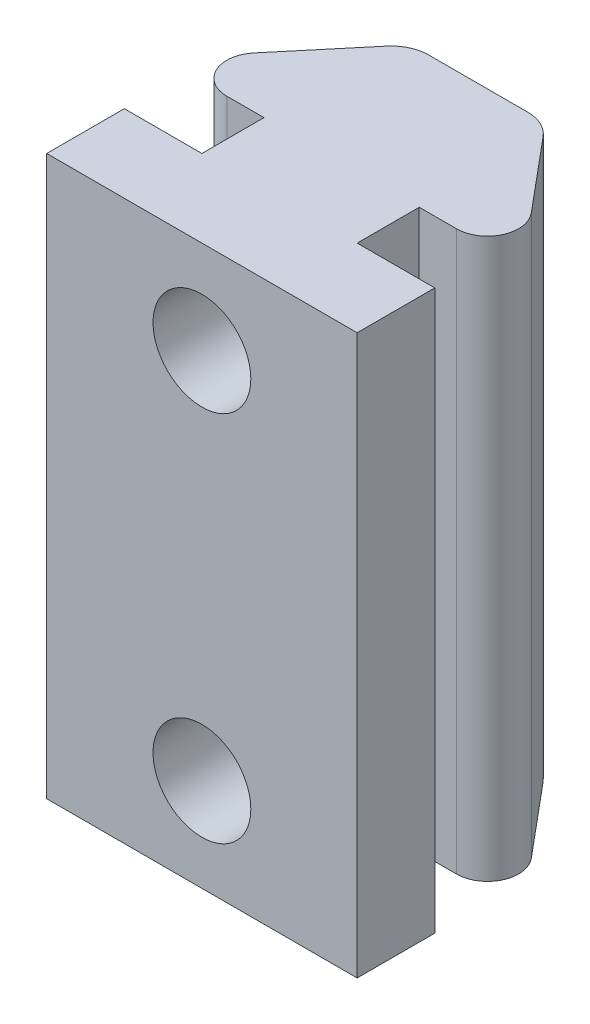
ISO-10303-21;
HEADER;
FILE_DESCRIPTION(('STEP AP214'),'2;1');
FILE_NAME('part.step','',(''),(''),'','','');
FILE_SCHEMA(('AUTOMOTIVE_DESIGN { 1 0 10303 214 1 1 1 1 }'));
ENDSEC;
DATA;
#1=APPLICATION_CONTEXT('core data for automotive mechanical design processes');
#2=APPLICATION_PROTOCOL_DEFINITION('international standard','automotive_design',2000,#1);
#3=PRODUCT_CONTEXT('',#1,'mechanical');
#4=PRODUCT('Part','Part','',(#3));
#5=PRODUCT_RELATED_PRODUCT_CATEGORY('part','',(#4));
#6=PRODUCT_DEFINITION_FORMATION('','',#4);
#7=PRODUCT_DEFINITION_CONTEXT('part definition',#1,'design');
#8=PRODUCT_DEFINITION('design','',#6,#7);
#9=PRODUCT_DEFINITION_SHAPE('','',#8);
#10=(LENGTH_UNIT() NAMED_UNIT(*) SI_UNIT(.MILLI.,.METRE.));
#11=(NAMED_UNIT(*) PLANE_ANGLE_UNIT() SI_UNIT($,.RADIAN.));
#12=(NAMED_UNIT(*) SI_UNIT($,.STERADIAN.) SOLID_ANGLE_UNIT());
#13=UNCERTAINTY_MEASURE_WITH_UNIT(LENGTH_MEASURE(1.E-05),#10,'distance_accuracy_value','');
#14=(GEOMETRIC_REPRESENTATION_CONTEXT(3) GLOBAL_UNCERTAINTY_ASSIGNED_CONTEXT((#13)) GLOBAL_UNIT_ASSIGNED_CONTEXT((#10,
#11,#12)) REPRESENTATION_CONTEXT('',''));
#15=CARTESIAN_POINT('',(0.,0.,0.));
#16=DIRECTION('',(0.,0.,1.));
#17=DIRECTION('',(1.,0.,0.));
#18=AXIS2_PLACEMENT_3D('',#15,#16,#17);
#19=CARTESIAN_POINT('',(0.,0.,0.));
#20=DIRECTION('',(0.,0.,1.));
#21=DIRECTION('',(1.,0.,0.));
#22=AXIS2_PLACEMENT_3D('',#19,#20,#21);
#23=PLANE('',#22);
#24=DIRECTION('',(0.,1.,0.));
#25=VECTOR('',#24,1.);
#26=CARTESIAN_POINT('',(-3.175,-25.8729235263508,0.));
#27=LINE('',#26,#25);
#28=CARTESIAN_POINT('',(-3.175,-11.43,0.));
#29=VERTEX_POINT('',#28);
#30=CARTESIAN_POINT('',(-3.175,11.43,0.));
#31=VERTEX_POINT('',#30);
#32=EDGE_CURVE('E64',#29,#31,#27,.T.);
#33=ORIENTED_EDGE('',*,*,#32,.F.);
#34=DIRECTION('',(1.,0.,0.));
#35=VECTOR('',#34,1.);
#36=CARTESIAN_POINT('',(-6.35,-11.43,0.));
#37=LINE('',#36,#35);
#38=CARTESIAN_POINT('',(-6.35,-11.43,0.));
#39=VERTEX_POINT('',#38);
#40=EDGE_CURVE('E251',#39,#29,#37,.T.);
#41=ORIENTED_EDGE('',*,*,#40,.F.);
#42=DIRECTION('',(0.,1.,0.));
#43=VECTOR('',#42,1.);
#44=CARTESIAN_POINT('',(-6.35,-11.43,0.));
#45=LINE('',#44,#43);
#46=CARTESIAN_POINT('',(-6.35,11.43,0.));
#47=VERTEX_POINT('',#46);
#48=EDGE_CURVE('E239',#39,#47,#45,.T.);
#49=ORIENTED_EDGE('',*,*,#48,.T.);
#50=DIRECTION('',(1.,0.,0.));
#51=VECTOR('',#50,1.);
#52=CARTESIAN_POINT('',(-6.35,11.43,0.));
#53=LINE('',#52,#51);
#54=EDGE_CURVE('E246',#47,#31,#53,.T.);
#55=ORIENTED_EDGE('',*,*,#54,.T.);
#56=EDGE_LOOP('',(#33,#41,#49,#55));
#57=FACE_BOUND('',#56,.T.);
#58=ADVANCED_FACE('F39',(#57),#23,.F.);
#59=CARTESIAN_POINT('',(-6.35,11.43,3.175));
#60=DIRECTION('',(0.,1.,0.));
#61=DIRECTION('',(0.,0.,1.));
#62=AXIS2_PLACEMENT_3D('',#59,#60,#61);
#63=PLANE('',#62);
#64=ORIENTED_EDGE('',*,*,#54,.F.);
#65=DIRECTION('',(0.,0.,-1.));
#66=VECTOR('',#65,1.);
#67=CARTESIAN_POINT('',(-6.35,11.43,3.175));
#68=LINE('',#67,#66);
#69=CARTESIAN_POINT('',(-6.35,11.43,3.175));
#70=VERTEX_POINT('',#69);
#71=EDGE_CURVE('E11',#70,#47,#68,.T.);
#72=ORIENTED_EDGE('',*,*,#71,.F.);
#73=DIRECTION('',(1.,0.,0.));
#74=VECTOR('',#73,1.);
#75=CARTESIAN_POINT('',(-6.35,11.43,3.175));
#76=LINE('',#75,#74);
#77=CARTESIAN_POINT('',(6.35,11.43,3.175));
#78=VERTEX_POINT('',#77);
#79=EDGE_CURVE('E235',#70,#78,#76,.T.);
#80=ORIENTED_EDGE('',*,*,#79,.T.);
#81=DIRECTION('',(0.,0.,-1.));
#82=VECTOR('',#81,1.);
#83=CARTESIAN_POINT('',(6.35,11.43,3.175));
#84=LINE('',#83,#82);
#85=CARTESIAN_POINT('',(6.35,11.43,0.));
#86=VERTEX_POINT('',#85);
#87=EDGE_CURVE('E43',#78,#86,#84,.T.);
#88=ORIENTED_EDGE('',*,*,#87,.T.);
#89=CARTESIAN_POINT('',(3.175,11.43,0.));
#90=VERTEX_POINT('',#89);
#91=EDGE_CURVE('E179',#90,#86,#53,.T.);
#92=ORIENTED_EDGE('',*,*,#91,.F.);
#93=DIRECTION('',(0.,0.,-1.));
#94=VECTOR('',#93,1.);
#95=CARTESIAN_POINT('',(3.175,11.43,0.));
#96=LINE('',#95,#94);
#97=CARTESIAN_POINT('',(3.175,11.43,-2.54));
#98=VERTEX_POINT('',#97);
#99=EDGE_CURVE('E160',#90,#98,#96,.T.);
#100=ORIENTED_EDGE('',*,*,#99,.T.);
#101=DIRECTION('',(1.,0.,0.));
#102=VECTOR('',#101,1.);
#103=CARTESIAN_POINT('',(3.175,11.43,-2.54));
#104=LINE('',#103,#102);
#105=CARTESIAN_POINT('',(4.69937299864937,11.43,-2.54));
#106=VERTEX_POINT('',#105);
#107=EDGE_CURVE('E168',#98,#106,#104,.T.);
#108=ORIENTED_EDGE('',*,*,#107,.T.);
#109=CARTESIAN_POINT('',(4.69937299864937,11.43,-3.81));
#110=DIRECTION('',(0.,1.,0.));
#111=DIRECTION('',(0.,0.,1.));
#112=AXIS2_PLACEMENT_3D('',#109,#110,#111);
#113=CIRCLE('',#112,1.27);
#114=CARTESIAN_POINT('',(5.67365047720945,11.43,-4.6246676590921));
#115=VERTEX_POINT('',#114);
#116=EDGE_CURVE('E174',#106,#115,#113,.T.);
#117=ORIENTED_EDGE('',*,*,#116,.T.);
#118=DIRECTION('',(-0.64147059771032,0.,-0.767147620913449));
#119=VECTOR('',#118,1.);
#120=CARTESIAN_POINT('',(5.67365047720945,11.43,-4.62466765909211));
#121=LINE('',#120,#119);
#122=CARTESIAN_POINT('',(3.20113297427209,11.43,-7.58160119091053));
#123=VERTEX_POINT('',#122);
#124=EDGE_CURVE('E190',#115,#123,#121,.T.);
#125=ORIENTED_EDGE('',*,*,#124,.T.);
#126=CARTESIAN_POINT('',(2.032,11.43,-6.604));
#127=DIRECTION('',(0.,1.,0.));
#128=DIRECTION('',(0.,0.,1.));
#129=AXIS2_PLACEMENT_3D('',#126,#127,#128);
#130=CIRCLE('',#129,1.524);
#131=CARTESIAN_POINT('',(2.032,11.43,-8.128));
#132=VERTEX_POINT('',#131);
#133=EDGE_CURVE('E193',#123,#132,#130,.T.);
#134=ORIENTED_EDGE('',*,*,#133,.T.);
#135=DIRECTION('',(-1.,0.,0.));
#136=VECTOR('',#135,1.);
#137=CARTESIAN_POINT('',(2.032,11.43,-8.128));
#138=LINE('',#137,#136);
#139=CARTESIAN_POINT('',(-2.032,11.43,-8.128));
#140=VERTEX_POINT('',#139);
#141=EDGE_CURVE('E196',#132,#140,#138,.T.);
#142=ORIENTED_EDGE('',*,*,#141,.T.);
#143=CARTESIAN_POINT('',(-2.032,11.43,-6.604));
#144=DIRECTION('',(0.,1.,0.));
#145=DIRECTION('',(0.,0.,-1.));
#146=AXIS2_PLACEMENT_3D('',#143,#144,#145);
#147=CIRCLE('',#146,1.524);
#148=CARTESIAN_POINT('',(-3.2011329742721,11.43,-7.58160119091053));
#149=VERTEX_POINT('',#148);
#150=EDGE_CURVE('E199',#140,#149,#147,.T.);
#151=ORIENTED_EDGE('',*,*,#150,.T.);
#152=DIRECTION('',(-0.64147059771032,0.,0.767147620913449));
#153=VECTOR('',#152,1.);
#154=CARTESIAN_POINT('',(-5.67365047720945,11.43,-4.62466765909211));
#155=LINE('',#154,#153);
#156=CARTESIAN_POINT('',(-5.67365047720945,11.43,-4.62466765909211));
#157=VERTEX_POINT('',#156);
#158=EDGE_CURVE('E202',#149,#157,#155,.T.);
#159=ORIENTED_EDGE('',*,*,#158,.T.);
#160=CARTESIAN_POINT('',(-4.69937299864937,11.43,-3.81));
#161=DIRECTION('',(0.,1.,0.));
#162=DIRECTION('',(0.,0.,-1.));
#163=AXIS2_PLACEMENT_3D('',#160,#161,#162);
#164=CIRCLE('',#163,1.27);
#165=CARTESIAN_POINT('',(-4.69937299864937,11.43,-2.54));
#166=VERTEX_POINT('',#165);
#167=EDGE_CURVE('E205',#157,#166,#164,.T.);
#168=ORIENTED_EDGE('',*,*,#167,.T.);
#169=DIRECTION('',(1.,0.,0.));
#170=VECTOR('',#169,1.);
#171=CARTESIAN_POINT('',(-3.175,11.43,-2.54));
#172=LINE('',#171,#170);
#173=CARTESIAN_POINT('',(-3.175,11.43,-2.54));
#174=VERTEX_POINT('',#173);
#175=EDGE_CURVE('E208',#166,#174,#172,.T.);
#176=ORIENTED_EDGE('',*,*,#175,.T.);
#177=DIRECTION('',(0.,0.,1.));
#178=VECTOR('',#177,1.);
#179=CARTESIAN_POINT('',(-3.175,11.43,0.));
#180=LINE('',#179,#178);
#181=EDGE_CURVE('E211',#174,#31,#180,.T.);
#182=ORIENTED_EDGE('',*,*,#181,.T.);
#183=EDGE_LOOP('',(#64,#72,#80,#88,#92,#100,#108,#117,#125,#134,#142,#151,#159,#168,#176,#182));
#184=FACE_BOUND('',#183,.T.);
#185=ADVANCED_FACE('F41',(#184),#63,.T.);
#186=CARTESIAN_POINT('',(-6.35,-11.43,3.175));
#187=DIRECTION('',(-1.,0.,0.));
#188=DIRECTION('',(0.,0.,1.));
#189=AXIS2_PLACEMENT_3D('',#186,#187,#188);
#190=PLANE('',#189);
#191=ORIENTED_EDGE('',*,*,#48,.F.);
#192=DIRECTION('',(0.,0.,-1.));
#193=VECTOR('',#192,1.);
#194=CARTESIAN_POINT('',(-6.35,-11.43,3.175));
#195=LINE('',#194,#193);
#196=CARTESIAN_POINT('',(-6.35,-11.43,3.175));
#197=VERTEX_POINT('',#196);
#198=EDGE_CURVE('E48',#197,#39,#195,.T.);
#199=ORIENTED_EDGE('',*,*,#198,.F.);
#200=DIRECTION('',(0.,1.,0.));
#201=VECTOR('',#200,1.);
#202=CARTESIAN_POINT('',(-6.35,-11.43,3.175));
#203=LINE('',#202,#201);
#204=EDGE_CURVE('E243',#197,#70,#203,.T.);
#205=ORIENTED_EDGE('',*,*,#204,.T.);
#206=ORIENTED_EDGE('',*,*,#71,.T.);
#207=EDGE_LOOP('',(#191,#199,#205,#206));
#208=FACE_BOUND('',#207,.T.);
#209=ADVANCED_FACE('F284',(#208),#190,.T.);
#210=CARTESIAN_POINT('',(-6.35,-11.43,3.175));
#211=DIRECTION('',(0.,1.,0.));
#212=DIRECTION('',(0.,0.,1.));
#213=AXIS2_PLACEMENT_3D('',#210,#211,#212);
#214=PLANE('',#213);
#215=ORIENTED_EDGE('',*,*,#40,.T.);
#216=DIRECTION('',(0.,0.,-1.));
#217=VECTOR('',#216,1.);
#218=CARTESIAN_POINT('',(-3.175,-11.43,0.));
#219=LINE('',#218,#217);
#220=CARTESIAN_POINT('',(-3.175,-11.43,-2.54));
#221=VERTEX_POINT('',#220);
#222=EDGE_CURVE('E186',#29,#221,#219,.T.);
#223=ORIENTED_EDGE('',*,*,#222,.T.);
#224=DIRECTION('',(-1.,0.,0.));
#225=VECTOR('',#224,1.);
#226=CARTESIAN_POINT('',(-3.175,-11.43,-2.54));
#227=LINE('',#226,#225);
#228=CARTESIAN_POINT('',(-4.69937299864937,-11.43,-2.54));
#229=VERTEX_POINT('',#228);
#230=EDGE_CURVE('E476',#221,#229,#227,.T.);
#231=ORIENTED_EDGE('',*,*,#230,.T.);
#232=CARTESIAN_POINT('',(-4.69937299864937,-11.43,-3.81));
#233=DIRECTION('',(0.,1.,0.));
#234=DIRECTION('',(0.,0.,1.));
#235=AXIS2_PLACEMENT_3D('',#232,#233,#234);
#236=CIRCLE('',#235,1.27);
#237=CARTESIAN_POINT('',(-5.67365047720945,-11.43,-4.62466765909211));
#238=VERTEX_POINT('',#237);
#239=EDGE_CURVE('E475',#229,#238,#236,.F.);
#240=ORIENTED_EDGE('',*,*,#239,.T.);
#241=DIRECTION('',(0.641470597710321,0.,-0.767147620913449));
#242=VECTOR('',#241,1.);
#243=CARTESIAN_POINT('',(-5.67365047720945,-11.43,-4.62466765909211));
#244=LINE('',#243,#242);
#245=CARTESIAN_POINT('',(-3.2011329742721,-11.43,-7.58160119091053));
#246=VERTEX_POINT('',#245);
#247=EDGE_CURVE('E473',#238,#246,#244,.T.);
#248=ORIENTED_EDGE('',*,*,#247,.T.);
#249=CARTESIAN_POINT('',(-2.032,-11.43,-6.604));
#250=DIRECTION('',(0.,1.,0.));
#251=DIRECTION('',(0.,0.,1.));
#252=AXIS2_PLACEMENT_3D('',#249,#250,#251);
#253=CIRCLE('',#252,1.524);
#254=CARTESIAN_POINT('',(-2.032,-11.43,-8.128));
#255=VERTEX_POINT('',#254);
#256=EDGE_CURVE('E471',#246,#255,#253,.F.);
#257=ORIENTED_EDGE('',*,*,#256,.T.);
#258=DIRECTION('',(1.,0.,0.));
#259=VECTOR('',#258,1.);
#260=CARTESIAN_POINT('',(2.032,-11.43,-8.128));
#261=LINE('',#260,#259);
#262=CARTESIAN_POINT('',(2.032,-11.43,-8.128));
#263=VERTEX_POINT('',#262);
#264=EDGE_CURVE('E469',#255,#263,#261,.T.);
#265=ORIENTED_EDGE('',*,*,#264,.T.);
#266=CARTESIAN_POINT('',(2.032,-11.43,-6.604));
#267=DIRECTION('',(0.,1.,0.));
#268=DIRECTION('',(0.,0.,1.));
#269=AXIS2_PLACEMENT_3D('',#266,#267,#268);
#270=CIRCLE('',#269,1.524);
#271=CARTESIAN_POINT('',(3.2011329742721,-11.43,-7.58160119091053));
#272=VERTEX_POINT('',#271);
#273=EDGE_CURVE('E467',#263,#272,#270,.F.);
#274=ORIENTED_EDGE('',*,*,#273,.T.);
#275=DIRECTION('',(0.641470597710321,0.,0.767147620913449));
#276=VECTOR('',#275,1.);
#277=CARTESIAN_POINT('',(5.67365047720945,-11.43,-4.62466765909211));
#278=LINE('',#277,#276);
#279=CARTESIAN_POINT('',(5.67365047720945,-11.43,-4.6246676590921));
#280=VERTEX_POINT('',#279);
#281=EDGE_CURVE('E465',#272,#280,#278,.T.);
#282=ORIENTED_EDGE('',*,*,#281,.T.);
#283=CARTESIAN_POINT('',(4.69937299864937,-11.43,-3.81));
#284=DIRECTION('',(0.,1.,0.));
#285=DIRECTION('',(0.,0.,1.));
#286=AXIS2_PLACEMENT_3D('',#283,#284,#285);
#287=CIRCLE('',#286,1.27);
#288=CARTESIAN_POINT('',(4.69937299864937,-11.43,-2.54));
#289=VERTEX_POINT('',#288);
#290=EDGE_CURVE('E463',#280,#289,#287,.F.);
#291=ORIENTED_EDGE('',*,*,#290,.T.);
#292=DIRECTION('',(-1.,0.,0.));
#293=VECTOR('',#292,1.);
#294=CARTESIAN_POINT('',(3.175,-11.43,-2.54));
#295=LINE('',#294,#293);
#296=CARTESIAN_POINT('',(3.175,-11.43,-2.54));
#297=VERTEX_POINT('',#296);
#298=EDGE_CURVE('E215',#289,#297,#295,.T.);
#299=ORIENTED_EDGE('',*,*,#298,.T.);
#300=DIRECTION('',(0.,0.,1.));
#301=VECTOR('',#300,1.);
#302=CARTESIAN_POINT('',(3.175,-11.43,0.));
#303=LINE('',#302,#301);
#304=CARTESIAN_POINT('',(3.175,-11.43,0.));
#305=VERTEX_POINT('',#304);
#306=EDGE_CURVE('E161',#297,#305,#303,.T.);
#307=ORIENTED_EDGE('',*,*,#306,.T.);
#308=CARTESIAN_POINT('',(6.35,-11.43,0.));
#309=VERTEX_POINT('',#308);
#310=EDGE_CURVE('E56',#305,#309,#37,.T.);
#311=ORIENTED_EDGE('',*,*,#310,.T.);
#312=DIRECTION('',(0.,0.,-1.));
#313=VECTOR('',#312,1.);
#314=CARTESIAN_POINT('',(6.35,-11.43,3.175));
#315=LINE('',#314,#313);
#316=CARTESIAN_POINT('',(6.35,-11.43,3.175));
#317=VERTEX_POINT('',#316);
#318=EDGE_CURVE('E255',#317,#309,#315,.T.);
#319=ORIENTED_EDGE('',*,*,#318,.F.);
#320=DIRECTION('',(1.,0.,0.));
#321=VECTOR('',#320,1.);
#322=CARTESIAN_POINT('',(-6.35,-11.43,3.175));
#323=LINE('',#322,#321);
#324=EDGE_CURVE('E241',#197,#317,#323,.T.);
#325=ORIENTED_EDGE('',*,*,#324,.F.);
#326=ORIENTED_EDGE('',*,*,#198,.T.);
#327=EDGE_LOOP('',(#215,#223,#231,#240,#248,#257,#265,#274,#282,#291,#299,#307,#311,#319,#325,#326));
#328=FACE_BOUND('',#327,.T.);
#329=ADVANCED_FACE('F288',(#328),#214,.F.);
#330=CARTESIAN_POINT('',(6.35,-11.43,3.175));
#331=DIRECTION('',(-1.,0.,0.));
#332=DIRECTION('',(0.,0.,1.));
#333=AXIS2_PLACEMENT_3D('',#330,#331,#332);
#334=PLANE('',#333);
#335=DIRECTION('',(0.,1.,0.));
#336=VECTOR('',#335,1.);
#337=CARTESIAN_POINT('',(6.35,-11.43,0.));
#338=LINE('',#337,#336);
#339=EDGE_CURVE('E248',#309,#86,#338,.T.);
#340=ORIENTED_EDGE('',*,*,#339,.T.);
#341=ORIENTED_EDGE('',*,*,#87,.F.);
#342=DIRECTION('',(0.,1.,0.));
#343=VECTOR('',#342,1.);
#344=CARTESIAN_POINT('',(6.35,-11.43,3.175));
#345=LINE('',#344,#343);
#346=EDGE_CURVE('E238',#317,#78,#345,.T.);
#347=ORIENTED_EDGE('',*,*,#346,.F.);
#348=ORIENTED_EDGE('',*,*,#318,.T.);
#349=EDGE_LOOP('',(#340,#341,#347,#348));
#350=FACE_BOUND('',#349,.T.);
#351=ADVANCED_FACE('F262',(#350),#334,.F.);
#352=CARTESIAN_POINT('',(0.,0.,3.175));
#353=DIRECTION('',(0.,0.,1.));
#354=DIRECTION('',(1.,0.,0.));
#355=AXIS2_PLACEMENT_3D('',#352,#353,#354);
#356=PLANE('',#355);
#357=CARTESIAN_POINT('',(0.,7.62,3.175));
#358=DIRECTION('',(0.,0.,1.));
#359=DIRECTION('',(1.,0.,0.));
#360=AXIS2_PLACEMENT_3D('',#357,#358,#359);
#361=CIRCLE('',#360,2.);
#362=CARTESIAN_POINT('',(2.,7.62,3.175));
#363=VERTEX_POINT('',#362);
#364=EDGE_CURVE('E183',#363,#363,#361,.T.);
#365=ORIENTED_EDGE('',*,*,#364,.F.);
#366=EDGE_LOOP('',(#365));
#367=FACE_BOUND('',#366,.T.);
#368=CARTESIAN_POINT('',(0.,-7.62,3.175));
#369=DIRECTION('',(0.,0.,1.));
#370=DIRECTION('',(-1.,0.,0.));
#371=AXIS2_PLACEMENT_3D('',#368,#369,#370);
#372=CIRCLE('',#371,2.);
#373=CARTESIAN_POINT('',(2.,-7.62,3.175));
#374=VERTEX_POINT('',#373);
#375=EDGE_CURVE('E454',#374,#374,#372,.T.);
#376=ORIENTED_EDGE('',*,*,#375,.F.);
#377=EDGE_LOOP('',(#376));
#378=FACE_BOUND('',#377,.T.);
#379=ORIENTED_EDGE('',*,*,#79,.F.);
#380=ORIENTED_EDGE('',*,*,#204,.F.);
#381=ORIENTED_EDGE('',*,*,#324,.T.);
#382=ORIENTED_EDGE('',*,*,#346,.T.);
#383=EDGE_LOOP('',(#379,#380,#381,#382));
#384=FACE_BOUND('',#383,.T.);
#385=ADVANCED_FACE('F266',(#367,#378,#384),#356,.T.);
#386=ORIENTED_EDGE('',*,*,#310,.F.);
#387=DIRECTION('',(0.,1.,0.));
#388=VECTOR('',#387,1.);
#389=CARTESIAN_POINT('',(3.175,-25.8729235263508,0.));
#390=LINE('',#389,#388);
#391=EDGE_CURVE('E165',#305,#90,#390,.T.);
#392=ORIENTED_EDGE('',*,*,#391,.T.);
#393=ORIENTED_EDGE('',*,*,#91,.T.);
#394=ORIENTED_EDGE('',*,*,#339,.F.);
#395=EDGE_LOOP('',(#386,#392,#393,#394));
#396=FACE_BOUND('',#395,.T.);
#397=ADVANCED_FACE('F263',(#396),#23,.F.);
#398=CARTESIAN_POINT('',(-3.175,-25.8729235263508,0.));
#399=DIRECTION('',(-1.,0.,0.));
#400=DIRECTION('',(0.,0.,1.));
#401=AXIS2_PLACEMENT_3D('',#398,#399,#400);
#402=PLANE('',#401);
#403=ORIENTED_EDGE('',*,*,#222,.F.);
#404=ORIENTED_EDGE('',*,*,#32,.T.);
#405=ORIENTED_EDGE('',*,*,#181,.F.);
#406=DIRECTION('',(0.,1.,0.));
#407=VECTOR('',#406,1.);
#408=CARTESIAN_POINT('',(-3.175,-25.8729235263508,-2.54));
#409=LINE('',#408,#407);
#410=EDGE_CURVE('E216',#221,#174,#409,.T.);
#411=ORIENTED_EDGE('',*,*,#410,.F.);
#412=EDGE_LOOP('',(#403,#404,#405,#411));
#413=FACE_BOUND('',#412,.T.);
#414=ADVANCED_FACE('F265',(#413),#402,.T.);
#415=CARTESIAN_POINT('',(-3.175,-25.8729235263508,-2.54));
#416=DIRECTION('',(0.,0.,1.));
#417=DIRECTION('',(1.,0.,0.));
#418=AXIS2_PLACEMENT_3D('',#415,#416,#417);
#419=PLANE('',#418);
#420=ORIENTED_EDGE('',*,*,#230,.F.);
#421=ORIENTED_EDGE('',*,*,#410,.T.);
#422=ORIENTED_EDGE('',*,*,#175,.F.);
#423=DIRECTION('',(0.,1.,0.));
#424=VECTOR('',#423,1.);
#425=CARTESIAN_POINT('',(-4.69937299864937,-25.8729235263508,-2.54));
#426=LINE('',#425,#424);
#427=EDGE_CURVE('E218',#229,#166,#426,.T.);
#428=ORIENTED_EDGE('',*,*,#427,.F.);
#429=EDGE_LOOP('',(#420,#421,#422,#428));
#430=FACE_BOUND('',#429,.T.);
#431=ADVANCED_FACE('F272',(#430),#419,.T.);
#432=CARTESIAN_POINT('',(-4.69937299864937,-25.8729235263508,-3.81));
#433=DIRECTION('',(0.,1.,0.));
#434=DIRECTION('',(0.,0.,1.));
#435=AXIS2_PLACEMENT_3D('',#432,#433,#434);
#436=CYLINDRICAL_SURFACE('',#435,1.27);
#437=ORIENTED_EDGE('',*,*,#239,.F.);
#438=ORIENTED_EDGE('',*,*,#427,.T.);
#439=ORIENTED_EDGE('',*,*,#167,.F.);
#440=DIRECTION('',(0.,1.,0.));
#441=VECTOR('',#440,1.);
#442=CARTESIAN_POINT('',(-5.67365047720945,-25.8729235263508,-4.62466765909211));
#443=LINE('',#442,#441);
#444=EDGE_CURVE('E220',#238,#157,#443,.T.);
#445=ORIENTED_EDGE('',*,*,#444,.F.);
#446=EDGE_LOOP('',(#437,#438,#439,#445));
#447=FACE_BOUND('',#446,.T.);
#448=ADVANCED_FACE('F343',(#447),#436,.T.);
#449=CARTESIAN_POINT('',(-5.67365047720945,-25.8729235263508,-4.62466765909211));
#450=DIRECTION('',(-0.767147620913449,0.,-0.64147059771032));
#451=DIRECTION('',(-0.641470597710321,0.,0.767147620913449));
#452=AXIS2_PLACEMENT_3D('',#449,#450,#451);
#453=PLANE('',#452);
#454=ORIENTED_EDGE('',*,*,#247,.F.);
#455=ORIENTED_EDGE('',*,*,#444,.T.);
#456=ORIENTED_EDGE('',*,*,#158,.F.);
#457=DIRECTION('',(0.,1.,0.));
#458=VECTOR('',#457,1.);
#459=CARTESIAN_POINT('',(-3.2011329742721,-25.8729235263508,-7.58160119091053));
#460=LINE('',#459,#458);
#461=EDGE_CURVE('E222',#246,#149,#460,.T.);
#462=ORIENTED_EDGE('',*,*,#461,.F.);
#463=EDGE_LOOP('',(#454,#455,#456,#462));
#464=FACE_BOUND('',#463,.T.);
#465=ADVANCED_FACE('F353',(#464),#453,.T.);
#466=CARTESIAN_POINT('',(-2.032,-25.8729235263508,-6.604));
#467=DIRECTION('',(0.,1.,0.));
#468=DIRECTION('',(0.,0.,1.));
#469=AXIS2_PLACEMENT_3D('',#466,#467,#468);
#470=CYLINDRICAL_SURFACE('',#469,1.524);
#471=ORIENTED_EDGE('',*,*,#256,.F.);
#472=ORIENTED_EDGE('',*,*,#461,.T.);
#473=ORIENTED_EDGE('',*,*,#150,.F.);
#474=DIRECTION('',(0.,1.,0.));
#475=VECTOR('',#474,1.);
#476=CARTESIAN_POINT('',(-2.032,-25.8729235263508,-8.128));
#477=LINE('',#476,#475);
#478=EDGE_CURVE('E224',#255,#140,#477,.T.);
#479=ORIENTED_EDGE('',*,*,#478,.F.);
#480=EDGE_LOOP('',(#471,#472,#473,#479));
#481=FACE_BOUND('',#480,.T.);
#482=ADVANCED_FACE('F363',(#481),#470,.T.);
#483=CARTESIAN_POINT('',(2.032,-25.8729235263508,-8.128));
#484=DIRECTION('',(0.,0.,-1.));
#485=DIRECTION('',(-1.,0.,0.));
#486=AXIS2_PLACEMENT_3D('',#483,#484,#485);
#487=PLANE('',#486);
#488=CARTESIAN_POINT('',(0.,7.62,-8.128));
#489=DIRECTION('',(0.,0.,1.));
#490=DIRECTION('',(1.,0.,0.));
#491=AXIS2_PLACEMENT_3D('',#488,#489,#490);
#492=CIRCLE('',#491,2.);
#493=CARTESIAN_POINT('',(2.,7.62,-8.128));
#494=VERTEX_POINT('',#493);
#495=EDGE_CURVE('E180',#494,#494,#492,.T.);
#496=ORIENTED_EDGE('',*,*,#495,.T.);
#497=EDGE_LOOP('',(#496));
#498=FACE_BOUND('',#497,.T.);
#499=CARTESIAN_POINT('',(0.,-7.62,-8.128));
#500=DIRECTION('',(0.,0.,1.));
#501=DIRECTION('',(-1.,0.,0.));
#502=AXIS2_PLACEMENT_3D('',#499,#500,#501);
#503=CIRCLE('',#502,2.);
#504=CARTESIAN_POINT('',(2.,-7.62,-8.128));
#505=VERTEX_POINT('',#504);
#506=EDGE_CURVE('E457',#505,#505,#503,.T.);
#507=ORIENTED_EDGE('',*,*,#506,.T.);
#508=EDGE_LOOP('',(#507));
#509=FACE_BOUND('',#508,.T.);
#510=ORIENTED_EDGE('',*,*,#264,.F.);
#511=ORIENTED_EDGE('',*,*,#478,.T.);
#512=ORIENTED_EDGE('',*,*,#141,.F.);
#513=DIRECTION('',(0.,1.,0.));
#514=VECTOR('',#513,1.);
#515=CARTESIAN_POINT('',(2.032,-25.8729235263508,-8.128));
#516=LINE('',#515,#514);
#517=EDGE_CURVE('E226',#263,#132,#516,.T.);
#518=ORIENTED_EDGE('',*,*,#517,.F.);
#519=EDGE_LOOP('',(#510,#511,#512,#518));
#520=FACE_BOUND('',#519,.T.);
#521=ADVANCED_FACE('F373',(#498,#509,#520),#487,.T.);
#522=CARTESIAN_POINT('',(2.032,-25.8729235263508,-6.604));
#523=DIRECTION('',(0.,1.,0.));
#524=DIRECTION('',(0.,0.,1.));
#525=AXIS2_PLACEMENT_3D('',#522,#523,#524);
#526=CYLINDRICAL_SURFACE('',#525,1.524);
#527=ORIENTED_EDGE('',*,*,#273,.F.);
#528=ORIENTED_EDGE('',*,*,#517,.T.);
#529=ORIENTED_EDGE('',*,*,#133,.F.);
#530=DIRECTION('',(0.,1.,0.));
#531=VECTOR('',#530,1.);
#532=CARTESIAN_POINT('',(3.20113297427209,-25.8729235263508,-7.58160119091053));
#533=LINE('',#532,#531);
#534=EDGE_CURVE('E228',#272,#123,#533,.T.);
#535=ORIENTED_EDGE('',*,*,#534,.F.);
#536=EDGE_LOOP('',(#527,#528,#529,#535));
#537=FACE_BOUND('',#536,.T.);
#538=ADVANCED_FACE('F383',(#537),#526,.T.);
#539=CARTESIAN_POINT('',(5.67365047720945,-25.8729235263508,-4.62466765909211));
#540=DIRECTION('',(0.767147620913449,0.,-0.64147059771032));
#541=DIRECTION('',(-0.641470597710321,0.,-0.767147620913449));
#542=AXIS2_PLACEMENT_3D('',#539,#540,#541);
#543=PLANE('',#542);
#544=ORIENTED_EDGE('',*,*,#281,.F.);
#545=ORIENTED_EDGE('',*,*,#534,.T.);
#546=ORIENTED_EDGE('',*,*,#124,.F.);
#547=DIRECTION('',(0.,1.,0.));
#548=VECTOR('',#547,1.);
#549=CARTESIAN_POINT('',(5.67365047720945,-25.8729235263508,-4.6246676590921));
#550=LINE('',#549,#548);
#551=EDGE_CURVE('E230',#280,#115,#550,.T.);
#552=ORIENTED_EDGE('',*,*,#551,.F.);
#553=EDGE_LOOP('',(#544,#545,#546,#552));
#554=FACE_BOUND('',#553,.T.);
#555=ADVANCED_FACE('F393',(#554),#543,.T.);
#556=CARTESIAN_POINT('',(4.69937299864937,-25.8729235263508,-3.81));
#557=DIRECTION('',(0.,1.,0.));
#558=DIRECTION('',(0.,0.,1.));
#559=AXIS2_PLACEMENT_3D('',#556,#557,#558);
#560=CYLINDRICAL_SURFACE('',#559,1.27);
#561=ORIENTED_EDGE('',*,*,#290,.F.);
#562=ORIENTED_EDGE('',*,*,#551,.T.);
#563=ORIENTED_EDGE('',*,*,#116,.F.);
#564=DIRECTION('',(0.,1.,0.));
#565=VECTOR('',#564,1.);
#566=CARTESIAN_POINT('',(4.69937299864937,-25.8729235263508,-2.54));
#567=LINE('',#566,#565);
#568=EDGE_CURVE('E164',#289,#106,#567,.T.);
#569=ORIENTED_EDGE('',*,*,#568,.F.);
#570=EDGE_LOOP('',(#561,#562,#563,#569));
#571=FACE_BOUND('',#570,.T.);
#572=ADVANCED_FACE('F403',(#571),#560,.T.);
#573=CARTESIAN_POINT('',(3.175,-25.8729235263508,-2.54));
#574=DIRECTION('',(0.,0.,1.));
#575=DIRECTION('',(1.,0.,0.));
#576=AXIS2_PLACEMENT_3D('',#573,#574,#575);
#577=PLANE('',#576);
#578=ORIENTED_EDGE('',*,*,#298,.F.);
#579=ORIENTED_EDGE('',*,*,#568,.T.);
#580=ORIENTED_EDGE('',*,*,#107,.F.);
#581=DIRECTION('',(0.,1.,0.));
#582=VECTOR('',#581,1.);
#583=CARTESIAN_POINT('',(3.175,-25.8729235263508,-2.54));
#584=LINE('',#583,#582);
#585=EDGE_CURVE('E155',#297,#98,#584,.T.);
#586=ORIENTED_EDGE('',*,*,#585,.F.);
#587=EDGE_LOOP('',(#578,#579,#580,#586));
#588=FACE_BOUND('',#587,.T.);
#589=ADVANCED_FACE('F169',(#588),#577,.T.);
#590=CARTESIAN_POINT('',(3.175,-25.8729235263508,0.));
#591=DIRECTION('',(1.,0.,0.));
#592=DIRECTION('',(0.,0.,-1.));
#593=AXIS2_PLACEMENT_3D('',#590,#591,#592);
#594=PLANE('',#593);
#595=ORIENTED_EDGE('',*,*,#306,.F.);
#596=ORIENTED_EDGE('',*,*,#585,.T.);
#597=ORIENTED_EDGE('',*,*,#99,.F.);
#598=ORIENTED_EDGE('',*,*,#391,.F.);
#599=EDGE_LOOP('',(#595,#596,#597,#598));
#600=FACE_BOUND('',#599,.T.);
#601=ADVANCED_FACE('F157',(#600),#594,.T.);
#602=CARTESIAN_POINT('',(0.,-7.62,-8.128));
#603=DIRECTION('',(0.,0.,1.));
#604=DIRECTION('',(1.,0.,0.));
#605=AXIS2_PLACEMENT_3D('',#602,#603,#604);
#606=CYLINDRICAL_SURFACE('',#605,2.);
#607=CARTESIAN_POINT('',(2.,-7.62,-8.128));
#608=CARTESIAN_POINT('',(2.,-7.62,-8.01026041666667));
#609=CARTESIAN_POINT('',(2.,-7.62,-7.89252083333333));
#610=CARTESIAN_POINT('',(2.,-7.62,-7.65704166666667));
#611=CARTESIAN_POINT('',(2.,-7.62,-7.53930208333333));
#612=CARTESIAN_POINT('',(2.,-7.62,-7.30382291666667));
#613=CARTESIAN_POINT('',(2.,-7.62,-7.18608333333333));
#614=CARTESIAN_POINT('',(2.,-7.62,-6.95060416666667));
#615=CARTESIAN_POINT('',(2.,-7.62,-6.83286458333333));
#616=CARTESIAN_POINT('',(2.,-7.62,-6.59738541666667));
#617=CARTESIAN_POINT('',(2.,-7.62,-6.47964583333333));
#618=CARTESIAN_POINT('',(2.,-7.62,-6.24416666666667));
#619=CARTESIAN_POINT('',(2.,-7.62,-6.12642708333333));
#620=CARTESIAN_POINT('',(2.,-7.62,-5.89094791666667));
#621=CARTESIAN_POINT('',(2.,-7.62,-5.77320833333333));
#622=CARTESIAN_POINT('',(2.,-7.62,-5.53772916666667));
#623=CARTESIAN_POINT('',(2.,-7.62,-5.41998958333333));
#624=CARTESIAN_POINT('',(2.,-7.62,-5.18451041666667));
#625=CARTESIAN_POINT('',(2.,-7.62,-5.06677083333333));
#626=CARTESIAN_POINT('',(2.,-7.62,-4.83129166666667));
#627=CARTESIAN_POINT('',(2.,-7.62,-4.71355208333333));
#628=CARTESIAN_POINT('',(2.,-7.62,-4.47807291666667));
#629=CARTESIAN_POINT('',(2.,-7.62,-4.36033333333333));
#630=CARTESIAN_POINT('',(2.,-7.62,-4.12485416666667));
#631=CARTESIAN_POINT('',(2.,-7.62,-4.00711458333334));
#632=CARTESIAN_POINT('',(2.,-7.62,-3.77163541666667));
#633=CARTESIAN_POINT('',(2.,-7.62,-3.65389583333333));
#634=CARTESIAN_POINT('',(2.,-7.62,-3.41841666666667));
#635=CARTESIAN_POINT('',(2.,-7.62,-3.30067708333333));
#636=CARTESIAN_POINT('',(2.,-7.62,-3.06519791666667));
#637=CARTESIAN_POINT('',(2.,-7.62,-2.94745833333333));
#638=CARTESIAN_POINT('',(2.,-7.62,-2.71197916666667));
#639=CARTESIAN_POINT('',(2.,-7.62,-2.59423958333333));
#640=CARTESIAN_POINT('',(2.,-7.62,-2.35876041666667));
#641=CARTESIAN_POINT('',(2.,-7.62,-2.24102083333333));
#642=CARTESIAN_POINT('',(2.,-7.62,-2.00554166666667));
#643=CARTESIAN_POINT('',(2.,-7.62,-1.88780208333333));
#644=CARTESIAN_POINT('',(2.,-7.62,-1.65232291666667));
#645=CARTESIAN_POINT('',(2.,-7.62,-1.53458333333333));
#646=CARTESIAN_POINT('',(2.,-7.62,-1.29910416666667));
#647=CARTESIAN_POINT('',(2.,-7.62,-1.18136458333333));
#648=CARTESIAN_POINT('',(2.,-7.62,-0.945885416666668));
#649=CARTESIAN_POINT('',(2.,-7.62,-0.828145833333334));
#650=CARTESIAN_POINT('',(2.,-7.62,-0.592666666666668));
#651=CARTESIAN_POINT('',(2.,-7.62,-0.474927083333335));
#652=CARTESIAN_POINT('',(2.,-7.62,-0.239447916666668));
#653=CARTESIAN_POINT('',(2.,-7.62,-0.121708333333335));
#654=CARTESIAN_POINT('',(2.,-7.62,0.113770833333332));
#655=CARTESIAN_POINT('',(2.,-7.62,0.231510416666665));
#656=CARTESIAN_POINT('',(2.,-7.62,0.466989583333332));
#657=CARTESIAN_POINT('',(2.,-7.62,0.584729166666666));
#658=CARTESIAN_POINT('',(2.,-7.62,0.820208333333333));
#659=CARTESIAN_POINT('',(2.,-7.62,0.937947916666666));
#660=CARTESIAN_POINT('',(2.,-7.62,1.17342708333333));
#661=CARTESIAN_POINT('',(2.,-7.62,1.29116666666667));
#662=CARTESIAN_POINT('',(2.,-7.62,1.52664583333333));
#663=CARTESIAN_POINT('',(2.,-7.62,1.64438541666667));
#664=CARTESIAN_POINT('',(2.,-7.62,1.87986458333333));
#665=CARTESIAN_POINT('',(2.,-7.62,1.99760416666666));
#666=CARTESIAN_POINT('',(2.,-7.62,2.23308333333333));
#667=CARTESIAN_POINT('',(2.,-7.62,2.35082291666667));
#668=CARTESIAN_POINT('',(2.,-7.62,2.58630208333333));
#669=CARTESIAN_POINT('',(2.,-7.62,2.70404166666667));
#670=CARTESIAN_POINT('',(2.,-7.62,2.93952083333333));
#671=CARTESIAN_POINT('',(2.,-7.62,3.05726041666667));
#672=CARTESIAN_POINT('',(2.,-7.62,3.175));
#673=B_SPLINE_CURVE_WITH_KNOTS('',3,(#607,#608,#609,#610,#611,#612,#613,#614,#615,#616,#617,
#618,#619,#620,#621,#622,#623,#624,#625,#626,#627,#628,#629,#630,#631,#632,#633,#634,#635,#636,
#637,#638,#639,#640,#641,#642,#643,#644,#645,#646,#647,#648,#649,#650,#651,#652,#653,#654,#655,
#656,#657,#658,#659,#660,#661,#662,#663,#664,#665,#666,#667,#668,#669,#670,#671,#672),
.UNSPECIFIED.,.F.,.F.,(4,2,2,2,2,2,2,2,2,2,2,2,2,2,2,2,2,2,2,2,2,2,2,2,2,2,2,2,2,2,2,2,4),(0.,
0.353218749999999,0.706437499999999,1.05965625,1.412875,1.76609375,2.1193125,2.47253125,2.82575,
3.17896875,3.5321875,3.88540625,4.238625,4.59184375,4.9450625,5.29828125,5.6515,6.00471875,
6.3579375,6.71115625,7.064375,7.41759375,7.7708125,8.12403125,8.47725,8.83046875,9.1836875,
9.53690625,9.890125,10.24334375,10.5965625,10.94978125,11.303),.UNSPECIFIED.);
#674=EDGE_CURVE('BSEAM429',#505,#374,#673,.T.);
#675=ORIENTED_EDGE('',*,*,#506,.F.);
#676=ORIENTED_EDGE('',*,*,#375,.T.);
#677=ORIENTED_EDGE('',*,*,#674,.T.);
#678=ORIENTED_EDGE('',*,*,#674,.F.);
#679=EDGE_LOOP('',(#675,#677,#676,#678));
#680=FACE_BOUND('',#679,.T.);
#681=ADVANCED_FACE('F429',(#680),#606,.F.);
#682=CARTESIAN_POINT('',(0.,7.62,-8.128));
#683=DIRECTION('',(0.,0.,1.));
#684=DIRECTION('',(1.,0.,0.));
#685=AXIS2_PLACEMENT_3D('',#682,#683,#684);
#686=CYLINDRICAL_SURFACE('',#685,2.);
#687=CARTESIAN_POINT('',(2.,7.62,-8.128));
#688=CARTESIAN_POINT('',(2.,7.62,-8.01026041666667));
#689=CARTESIAN_POINT('',(2.,7.62,-7.89252083333333));
#690=CARTESIAN_POINT('',(2.,7.62,-7.65704166666667));
#691=CARTESIAN_POINT('',(2.,7.62,-7.53930208333333));
#692=CARTESIAN_POINT('',(2.,7.62,-7.30382291666667));
#693=CARTESIAN_POINT('',(2.,7.62,-7.18608333333333));
#694=CARTESIAN_POINT('',(2.,7.62,-6.95060416666667));
#695=CARTESIAN_POINT('',(2.,7.62,-6.83286458333333));
#696=CARTESIAN_POINT('',(2.,7.62,-6.59738541666667));
#697=CARTESIAN_POINT('',(2.,7.62,-6.47964583333333));
#698=CARTESIAN_POINT('',(2.,7.62,-6.24416666666667));
#699=CARTESIAN_POINT('',(2.,7.62,-6.12642708333333));
#700=CARTESIAN_POINT('',(2.,7.62,-5.89094791666667));
#701=CARTESIAN_POINT('',(2.,7.62,-5.77320833333333));
#702=CARTESIAN_POINT('',(2.,7.62,-5.53772916666667));
#703=CARTESIAN_POINT('',(2.,7.62,-5.41998958333333));
#704=CARTESIAN_POINT('',(2.,7.62,-5.18451041666667));
#705=CARTESIAN_POINT('',(2.,7.62,-5.06677083333333));
#706=CARTESIAN_POINT('',(2.,7.62,-4.83129166666667));
#707=CARTESIAN_POINT('',(2.,7.62,-4.71355208333333));
#708=CARTESIAN_POINT('',(2.,7.62,-4.47807291666667));
#709=CARTESIAN_POINT('',(2.,7.62,-4.36033333333333));
#710=CARTESIAN_POINT('',(2.,7.62,-4.12485416666667));
#711=CARTESIAN_POINT('',(2.,7.62,-4.00711458333334));
#712=CARTESIAN_POINT('',(2.,7.62,-3.77163541666667));
#713=CARTESIAN_POINT('',(2.,7.62,-3.65389583333333));
#714=CARTESIAN_POINT('',(2.,7.62,-3.41841666666667));
#715=CARTESIAN_POINT('',(2.,7.62,-3.30067708333333));
#716=CARTESIAN_POINT('',(2.,7.62,-3.06519791666667));
#717=CARTESIAN_POINT('',(2.,7.62,-2.94745833333333));
#718=CARTESIAN_POINT('',(2.,7.62,-2.71197916666667));
#719=CARTESIAN_POINT('',(2.,7.62,-2.59423958333333));
#720=CARTESIAN_POINT('',(2.,7.62,-2.35876041666667));
#721=CARTESIAN_POINT('',(2.,7.62,-2.24102083333333));
#722=CARTESIAN_POINT('',(2.,7.62,-2.00554166666667));
#723=CARTESIAN_POINT('',(2.,7.62,-1.88780208333333));
#724=CARTESIAN_POINT('',(2.,7.62,-1.65232291666667));
#725=CARTESIAN_POINT('',(2.,7.62,-1.53458333333333));
#726=CARTESIAN_POINT('',(2.,7.62,-1.29910416666667));
#727=CARTESIAN_POINT('',(2.,7.62,-1.18136458333333));
#728=CARTESIAN_POINT('',(2.,7.62,-0.945885416666668));
#729=CARTESIAN_POINT('',(2.,7.62,-0.828145833333334));
#730=CARTESIAN_POINT('',(2.,7.62,-0.592666666666668));
#731=CARTESIAN_POINT('',(2.,7.62,-0.474927083333335));
#732=CARTESIAN_POINT('',(2.,7.62,-0.239447916666668));
#733=CARTESIAN_POINT('',(2.,7.62,-0.121708333333335));
#734=CARTESIAN_POINT('',(2.,7.62,0.113770833333332));
#735=CARTESIAN_POINT('',(2.,7.62,0.231510416666665));
#736=CARTESIAN_POINT('',(2.,7.62,0.466989583333332));
#737=CARTESIAN_POINT('',(2.,7.62,0.584729166666666));
#738=CARTESIAN_POINT('',(2.,7.62,0.820208333333333));
#739=CARTESIAN_POINT('',(2.,7.62,0.937947916666666));
#740=CARTESIAN_POINT('',(2.,7.62,1.17342708333333));
#741=CARTESIAN_POINT('',(2.,7.62,1.29116666666667));
#742=CARTESIAN_POINT('',(2.,7.62,1.52664583333333));
#743=CARTESIAN_POINT('',(2.,7.62,1.64438541666667));
#744=CARTESIAN_POINT('',(2.,7.62,1.87986458333333));
#745=CARTESIAN_POINT('',(2.,7.62,1.99760416666666));
#746=CARTESIAN_POINT('',(2.,7.62,2.23308333333333));
#747=CARTESIAN_POINT('',(2.,7.62,2.35082291666667));
#748=CARTESIAN_POINT('',(2.,7.62,2.58630208333333));
#749=CARTESIAN_POINT('',(2.,7.62,2.70404166666667));
#750=CARTESIAN_POINT('',(2.,7.62,2.93952083333333));
#751=CARTESIAN_POINT('',(2.,7.62,3.05726041666667));
#752=CARTESIAN_POINT('',(2.,7.62,3.175));
#753=B_SPLINE_CURVE_WITH_KNOTS('',3,(#687,#688,#689,#690,#691,#692,#693,#694,#695,#696,#697,
#698,#699,#700,#701,#702,#703,#704,#705,#706,#707,#708,#709,#710,#711,#712,#713,#714,#715,#716,
#717,#718,#719,#720,#721,#722,#723,#724,#725,#726,#727,#728,#729,#730,#731,#732,#733,#734,#735,
#736,#737,#738,#739,#740,#741,#742,#743,#744,#745,#746,#747,#748,#749,#750,#751,#752),
.UNSPECIFIED.,.F.,.F.,(4,2,2,2,2,2,2,2,2,2,2,2,2,2,2,2,2,2,2,2,2,2,2,2,2,2,2,2,2,2,2,2,4),(0.,
0.353218749999999,0.706437499999999,1.05965625,1.412875,1.76609375,2.1193125,2.47253125,2.82575,
3.17896875,3.5321875,3.88540625,4.238625,4.59184375,4.9450625,5.29828125,5.6515,6.00471875,
6.3579375,6.71115625,7.064375,7.41759375,7.7708125,8.12403125,8.47725,8.83046875,9.1836875,
9.53690625,9.890125,10.24334375,10.5965625,10.94978125,11.303),.UNSPECIFIED.);
#754=EDGE_CURVE('BSEAM437',#494,#363,#753,.T.);
#755=ORIENTED_EDGE('',*,*,#495,.F.);
#756=ORIENTED_EDGE('',*,*,#364,.T.);
#757=ORIENTED_EDGE('',*,*,#754,.T.);
#758=ORIENTED_EDGE('',*,*,#754,.F.);
#759=EDGE_LOOP('',(#755,#757,#756,#758));
#760=FACE_BOUND('',#759,.T.);
#761=ADVANCED_FACE('F437',(#760),#686,.F.);
#762=CLOSED_SHELL('',(#58,#185,#209,#329,#351,#385,#397,#414,#431,#448,#465,#482,#521,#538,#555,
#572,#589,#601,#681,#761));
#763=MANIFOLD_SOLID_BREP('B2',#762);
#764=ADVANCED_BREP_SHAPE_REPRESENTATION('',(#18,#763),#14);
#765=SHAPE_DEFINITION_REPRESENTATION(#9,#764);
ENDSEC;
END-ISO-10303-21;
